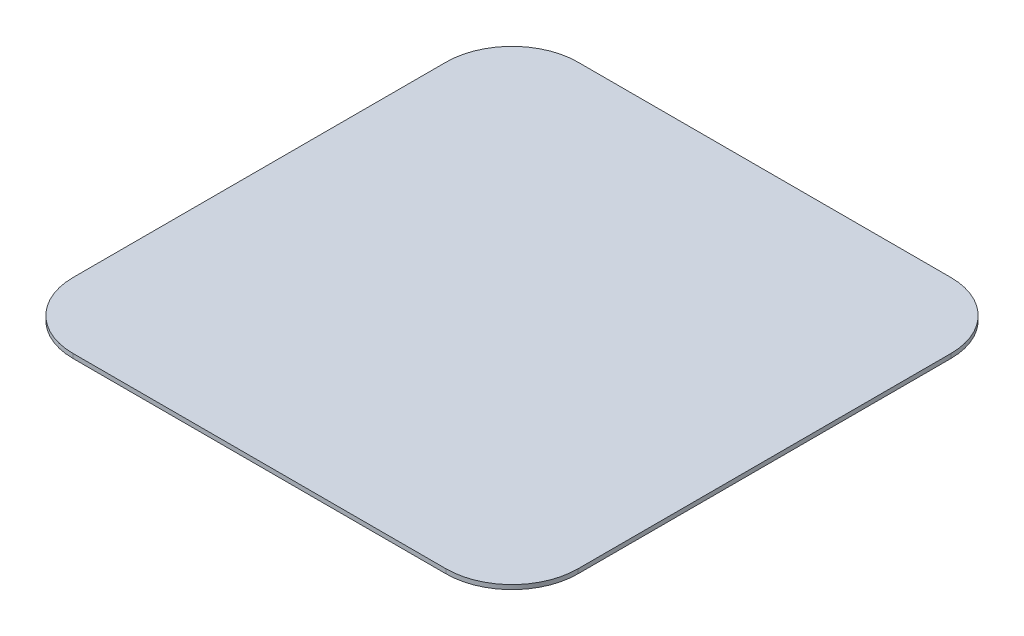
ISO-10303-21;
HEADER;
FILE_DESCRIPTION(('STEP AP214'),'2;1');
FILE_NAME('part.step','',(''),(''),'','','');
FILE_SCHEMA(('AUTOMOTIVE_DESIGN { 1 0 10303 214 1 1 1 1 }'));
ENDSEC;
DATA;
#1=APPLICATION_CONTEXT('core data for automotive mechanical design processes');
#2=APPLICATION_PROTOCOL_DEFINITION('international standard','automotive_design',2000,#1);
#3=PRODUCT_CONTEXT('',#1,'mechanical');
#4=PRODUCT('Part','Part','',(#3));
#5=PRODUCT_RELATED_PRODUCT_CATEGORY('part','',(#4));
#6=PRODUCT_DEFINITION_FORMATION('','',#4);
#7=PRODUCT_DEFINITION_CONTEXT('part definition',#1,'design');
#8=PRODUCT_DEFINITION('design','',#6,#7);
#9=PRODUCT_DEFINITION_SHAPE('','',#8);
#10=(LENGTH_UNIT() NAMED_UNIT(*) SI_UNIT(.MILLI.,.METRE.));
#11=(NAMED_UNIT(*) PLANE_ANGLE_UNIT() SI_UNIT($,.RADIAN.));
#12=(NAMED_UNIT(*) SI_UNIT($,.STERADIAN.) SOLID_ANGLE_UNIT());
#13=UNCERTAINTY_MEASURE_WITH_UNIT(LENGTH_MEASURE(1.E-05),#10,'distance_accuracy_value','');
#14=(GEOMETRIC_REPRESENTATION_CONTEXT(3) GLOBAL_UNCERTAINTY_ASSIGNED_CONTEXT((#13)) GLOBAL_UNIT_ASSIGNED_CONTEXT((#10,
#11,#12)) REPRESENTATION_CONTEXT('',''));
#15=CARTESIAN_POINT('',(0.,0.,0.));
#16=DIRECTION('',(0.,0.,1.));
#17=DIRECTION('',(1.,0.,0.));
#18=AXIS2_PLACEMENT_3D('',#15,#16,#17);
#19=CARTESIAN_POINT('',(115.,2.,-115.));
#20=DIRECTION('',(-1.,0.,0.));
#21=DIRECTION('',(0.,0.,1.));
#22=AXIS2_PLACEMENT_3D('',#19,#20,#21);
#23=PLANE('',#22);
#24=DIRECTION('',(0.,0.,-1.));
#25=VECTOR('',#24,1.);
#26=CARTESIAN_POINT('',(115.,0.,-115.));
#27=LINE('',#26,#25);
#28=CARTESIAN_POINT('',(115.,0.,85.));
#29=VERTEX_POINT('',#28);
#30=CARTESIAN_POINT('',(115.,0.,-85.));
#31=VERTEX_POINT('',#30);
#32=EDGE_CURVE('E141',#29,#31,#27,.T.);
#33=ORIENTED_EDGE('',*,*,#32,.T.);
#34=DIRECTION('',(0.,-1.,0.));
#35=VECTOR('',#34,1.);
#36=CARTESIAN_POINT('',(115.,2.,-85.));
#37=LINE('',#36,#35);
#38=CARTESIAN_POINT('',(115.,2.,-85.));
#39=VERTEX_POINT('',#38);
#40=EDGE_CURVE('E11',#31,#39,#37,.F.);
#41=ORIENTED_EDGE('',*,*,#40,.T.);
#42=DIRECTION('',(0.,0.,-1.));
#43=VECTOR('',#42,1.);
#44=CARTESIAN_POINT('',(115.,2.,-115.));
#45=LINE('',#44,#43);
#46=CARTESIAN_POINT('',(115.,2.,85.));
#47=VERTEX_POINT('',#46);
#48=EDGE_CURVE('E139',#47,#39,#45,.T.);
#49=ORIENTED_EDGE('',*,*,#48,.F.);
#50=DIRECTION('',(0.,-1.,0.));
#51=VECTOR('',#50,1.);
#52=CARTESIAN_POINT('',(115.,2.,85.));
#53=LINE('',#52,#51);
#54=EDGE_CURVE('E48',#47,#29,#53,.T.);
#55=ORIENTED_EDGE('',*,*,#54,.T.);
#56=EDGE_LOOP('',(#33,#41,#49,#55));
#57=FACE_BOUND('',#56,.T.);
#58=ADVANCED_FACE('F39',(#57),#23,.F.);
#59=CARTESIAN_POINT('',(-115.,2.,-115.));
#60=DIRECTION('',(0.,0.,1.));
#61=DIRECTION('',(1.,0.,0.));
#62=AXIS2_PLACEMENT_3D('',#59,#60,#61);
#63=PLANE('',#62);
#64=DIRECTION('',(-1.,0.,0.));
#65=VECTOR('',#64,1.);
#66=CARTESIAN_POINT('',(-115.,0.,-115.));
#67=LINE('',#66,#65);
#68=CARTESIAN_POINT('',(85.,0.,-115.));
#69=VERTEX_POINT('',#68);
#70=CARTESIAN_POINT('',(-85.,0.,-115.));
#71=VERTEX_POINT('',#70);
#72=EDGE_CURVE('E135',#69,#71,#67,.T.);
#73=ORIENTED_EDGE('',*,*,#72,.T.);
#74=DIRECTION('',(0.,-1.,0.));
#75=VECTOR('',#74,1.);
#76=CARTESIAN_POINT('',(-85.,2.,-115.));
#77=LINE('',#76,#75);
#78=CARTESIAN_POINT('',(-85.,2.,-115.));
#79=VERTEX_POINT('',#78);
#80=EDGE_CURVE('E111',#71,#79,#77,.F.);
#81=ORIENTED_EDGE('',*,*,#80,.T.);
#82=DIRECTION('',(-1.,0.,0.));
#83=VECTOR('',#82,1.);
#84=CARTESIAN_POINT('',(-115.,2.,-115.));
#85=LINE('',#84,#83);
#86=CARTESIAN_POINT('',(85.,2.,-115.));
#87=VERTEX_POINT('',#86);
#88=EDGE_CURVE('E193',#87,#79,#85,.T.);
#89=ORIENTED_EDGE('',*,*,#88,.F.);
#90=DIRECTION('',(0.,-1.,0.));
#91=VECTOR('',#90,1.);
#92=CARTESIAN_POINT('',(85.,2.,-115.));
#93=LINE('',#92,#91);
#94=EDGE_CURVE('E117',#87,#69,#93,.T.);
#95=ORIENTED_EDGE('',*,*,#94,.T.);
#96=EDGE_LOOP('',(#73,#81,#89,#95));
#97=FACE_BOUND('',#96,.T.);
#98=ADVANCED_FACE('F205',(#97),#63,.F.);
#99=CARTESIAN_POINT('',(-115.,2.,-115.));
#100=DIRECTION('',(1.,0.,0.));
#101=DIRECTION('',(0.,0.,-1.));
#102=AXIS2_PLACEMENT_3D('',#99,#100,#101);
#103=PLANE('',#102);
#104=DIRECTION('',(0.,0.,1.));
#105=VECTOR('',#104,1.);
#106=CARTESIAN_POINT('',(-115.,2.,-115.));
#107=LINE('',#106,#105);
#108=CARTESIAN_POINT('',(-115.,2.,-85.));
#109=VERTEX_POINT('',#108);
#110=CARTESIAN_POINT('',(-115.,2.,85.));
#111=VERTEX_POINT('',#110);
#112=EDGE_CURVE('E126',#109,#111,#107,.T.);
#113=ORIENTED_EDGE('',*,*,#112,.F.);
#114=DIRECTION('',(0.,-1.,0.));
#115=VECTOR('',#114,1.);
#116=CARTESIAN_POINT('',(-115.,2.,-85.));
#117=LINE('',#116,#115);
#118=CARTESIAN_POINT('',(-115.,0.,-85.));
#119=VERTEX_POINT('',#118);
#120=EDGE_CURVE('E110',#109,#119,#117,.T.);
#121=ORIENTED_EDGE('',*,*,#120,.T.);
#122=DIRECTION('',(0.,0.,1.));
#123=VECTOR('',#122,1.);
#124=CARTESIAN_POINT('',(-115.,0.,-115.));
#125=LINE('',#124,#123);
#126=CARTESIAN_POINT('',(-115.,0.,85.));
#127=VERTEX_POINT('',#126);
#128=EDGE_CURVE('E124',#119,#127,#125,.T.);
#129=ORIENTED_EDGE('',*,*,#128,.T.);
#130=DIRECTION('',(0.,-1.,0.));
#131=VECTOR('',#130,1.);
#132=CARTESIAN_POINT('',(-115.,2.,85.));
#133=LINE('',#132,#131);
#134=EDGE_CURVE('E129',#127,#111,#133,.F.);
#135=ORIENTED_EDGE('',*,*,#134,.T.);
#136=EDGE_LOOP('',(#113,#121,#129,#135));
#137=FACE_BOUND('',#136,.T.);
#138=ADVANCED_FACE('F123',(#137),#103,.F.);
#139=CARTESIAN_POINT('',(-115.,2.,115.));
#140=DIRECTION('',(0.,0.,-1.));
#141=DIRECTION('',(-1.,0.,0.));
#142=AXIS2_PLACEMENT_3D('',#139,#140,#141);
#143=PLANE('',#142);
#144=DIRECTION('',(1.,0.,0.));
#145=VECTOR('',#144,1.);
#146=CARTESIAN_POINT('',(-115.,2.,115.));
#147=LINE('',#146,#145);
#148=CARTESIAN_POINT('',(-85.,2.,115.));
#149=VERTEX_POINT('',#148);
#150=CARTESIAN_POINT('',(85.,2.,115.));
#151=VERTEX_POINT('',#150);
#152=EDGE_CURVE('E146',#149,#151,#147,.T.);
#153=ORIENTED_EDGE('',*,*,#152,.F.);
#154=DIRECTION('',(0.,-1.,0.));
#155=VECTOR('',#154,1.);
#156=CARTESIAN_POINT('',(-85.,2.,115.));
#157=LINE('',#156,#155);
#158=CARTESIAN_POINT('',(-85.,0.,115.));
#159=VERTEX_POINT('',#158);
#160=EDGE_CURVE('E173',#149,#159,#157,.T.);
#161=ORIENTED_EDGE('',*,*,#160,.T.);
#162=DIRECTION('',(1.,0.,0.));
#163=VECTOR('',#162,1.);
#164=CARTESIAN_POINT('',(-115.,0.,115.));
#165=LINE('',#164,#163);
#166=CARTESIAN_POINT('',(85.,0.,115.));
#167=VERTEX_POINT('',#166);
#168=EDGE_CURVE('E134',#159,#167,#165,.T.);
#169=ORIENTED_EDGE('',*,*,#168,.T.);
#170=DIRECTION('',(0.,-1.,0.));
#171=VECTOR('',#170,1.);
#172=CARTESIAN_POINT('',(85.,2.,115.));
#173=LINE('',#172,#171);
#174=EDGE_CURVE('E55',#167,#151,#173,.F.);
#175=ORIENTED_EDGE('',*,*,#174,.T.);
#176=EDGE_LOOP('',(#153,#161,#169,#175));
#177=FACE_BOUND('',#176,.T.);
#178=ADVANCED_FACE('F209',(#177),#143,.F.);
#179=CARTESIAN_POINT('',(0.,2.,0.));
#180=DIRECTION('',(0.,1.,0.));
#181=DIRECTION('',(0.,0.,1.));
#182=AXIS2_PLACEMENT_3D('',#179,#180,#181);
#183=PLANE('',#182);
#184=ORIENTED_EDGE('',*,*,#88,.T.);
#185=CARTESIAN_POINT('',(-85.,2.,-85.));
#186=DIRECTION('',(0.,1.,0.));
#187=DIRECTION('',(0.,0.,1.));
#188=AXIS2_PLACEMENT_3D('',#185,#186,#187);
#189=CIRCLE('',#188,30.);
#190=EDGE_CURVE('E168',#79,#109,#189,.T.);
#191=ORIENTED_EDGE('',*,*,#190,.T.);
#192=ORIENTED_EDGE('',*,*,#112,.T.);
#193=CARTESIAN_POINT('',(-85.,2.,85.));
#194=DIRECTION('',(0.,1.,0.));
#195=DIRECTION('',(0.,0.,1.));
#196=AXIS2_PLACEMENT_3D('',#193,#194,#195);
#197=CIRCLE('',#196,30.);
#198=EDGE_CURVE('E62',#111,#149,#197,.T.);
#199=ORIENTED_EDGE('',*,*,#198,.T.);
#200=ORIENTED_EDGE('',*,*,#152,.T.);
#201=CARTESIAN_POINT('',(85.,2.,85.));
#202=DIRECTION('',(0.,1.,0.));
#203=DIRECTION('',(0.,0.,1.));
#204=AXIS2_PLACEMENT_3D('',#201,#202,#203);
#205=CIRCLE('',#204,30.);
#206=EDGE_CURVE('E160',#151,#47,#205,.T.);
#207=ORIENTED_EDGE('',*,*,#206,.T.);
#208=ORIENTED_EDGE('',*,*,#48,.T.);
#209=CARTESIAN_POINT('',(85.,2.,-85.));
#210=DIRECTION('',(0.,1.,0.));
#211=DIRECTION('',(0.,0.,1.));
#212=AXIS2_PLACEMENT_3D('',#209,#210,#211);
#213=CIRCLE('',#212,30.);
#214=EDGE_CURVE('E163',#39,#87,#213,.T.);
#215=ORIENTED_EDGE('',*,*,#214,.T.);
#216=EDGE_LOOP('',(#184,#191,#192,#199,#200,#207,#208,#215));
#217=FACE_BOUND('',#216,.T.);
#218=ADVANCED_FACE('F199',(#217),#183,.T.);
#219=CARTESIAN_POINT('',(0.,0.,0.));
#220=DIRECTION('',(0.,1.,0.));
#221=DIRECTION('',(0.,0.,1.));
#222=AXIS2_PLACEMENT_3D('',#219,#220,#221);
#223=PLANE('',#222);
#224=ORIENTED_EDGE('',*,*,#128,.F.);
#225=CARTESIAN_POINT('',(-85.,0.,-85.));
#226=DIRECTION('',(0.,1.,0.));
#227=DIRECTION('',(0.,0.,1.));
#228=AXIS2_PLACEMENT_3D('',#225,#226,#227);
#229=CIRCLE('',#228,30.);
#230=EDGE_CURVE('E106',#119,#71,#229,.F.);
#231=ORIENTED_EDGE('',*,*,#230,.T.);
#232=ORIENTED_EDGE('',*,*,#72,.F.);
#233=CARTESIAN_POINT('',(85.,0.,-85.));
#234=DIRECTION('',(0.,1.,0.));
#235=DIRECTION('',(0.,0.,1.));
#236=AXIS2_PLACEMENT_3D('',#233,#234,#235);
#237=CIRCLE('',#236,30.);
#238=EDGE_CURVE('E150',#69,#31,#237,.F.);
#239=ORIENTED_EDGE('',*,*,#238,.T.);
#240=ORIENTED_EDGE('',*,*,#32,.F.);
#241=CARTESIAN_POINT('',(85.,0.,85.));
#242=DIRECTION('',(0.,1.,0.));
#243=DIRECTION('',(0.,0.,1.));
#244=AXIS2_PLACEMENT_3D('',#241,#242,#243);
#245=CIRCLE('',#244,30.);
#246=EDGE_CURVE('E128',#29,#167,#245,.F.);
#247=ORIENTED_EDGE('',*,*,#246,.T.);
#248=ORIENTED_EDGE('',*,*,#168,.F.);
#249=CARTESIAN_POINT('',(-85.,0.,85.));
#250=DIRECTION('',(0.,1.,0.));
#251=DIRECTION('',(0.,0.,1.));
#252=AXIS2_PLACEMENT_3D('',#249,#250,#251);
#253=CIRCLE('',#252,30.);
#254=EDGE_CURVE('E118',#159,#127,#253,.F.);
#255=ORIENTED_EDGE('',*,*,#254,.T.);
#256=EDGE_LOOP('',(#224,#231,#232,#239,#240,#247,#248,#255));
#257=FACE_BOUND('',#256,.T.);
#258=ADVANCED_FACE('F131',(#257),#223,.F.);
#259=CARTESIAN_POINT('',(-85.,2.,-85.));
#260=DIRECTION('',(0.,-1.,0.));
#261=DIRECTION('',(0.,0.,-1.));
#262=AXIS2_PLACEMENT_3D('',#259,#260,#261);
#263=CYLINDRICAL_SURFACE('',#262,30.);
#264=ORIENTED_EDGE('',*,*,#190,.F.);
#265=ORIENTED_EDGE('',*,*,#80,.F.);
#266=ORIENTED_EDGE('',*,*,#230,.F.);
#267=ORIENTED_EDGE('',*,*,#120,.F.);
#268=EDGE_LOOP('',(#264,#265,#266,#267));
#269=FACE_BOUND('',#268,.T.);
#270=ADVANCED_FACE('F109',(#269),#263,.T.);
#271=CARTESIAN_POINT('',(-85.,2.,85.));
#272=DIRECTION('',(0.,-1.,0.));
#273=DIRECTION('',(0.,0.,-1.));
#274=AXIS2_PLACEMENT_3D('',#271,#272,#273);
#275=CYLINDRICAL_SURFACE('',#274,30.);
#276=ORIENTED_EDGE('',*,*,#198,.F.);
#277=ORIENTED_EDGE('',*,*,#134,.F.);
#278=ORIENTED_EDGE('',*,*,#254,.F.);
#279=ORIENTED_EDGE('',*,*,#160,.F.);
#280=EDGE_LOOP('',(#276,#277,#278,#279));
#281=FACE_BOUND('',#280,.T.);
#282=ADVANCED_FACE('F208',(#281),#275,.T.);
#283=CARTESIAN_POINT('',(85.,2.,-85.));
#284=DIRECTION('',(0.,-1.,0.));
#285=DIRECTION('',(0.,0.,-1.));
#286=AXIS2_PLACEMENT_3D('',#283,#284,#285);
#287=CYLINDRICAL_SURFACE('',#286,30.);
#288=ORIENTED_EDGE('',*,*,#214,.F.);
#289=ORIENTED_EDGE('',*,*,#40,.F.);
#290=ORIENTED_EDGE('',*,*,#238,.F.);
#291=ORIENTED_EDGE('',*,*,#94,.F.);
#292=EDGE_LOOP('',(#288,#289,#290,#291));
#293=FACE_BOUND('',#292,.T.);
#294=ADVANCED_FACE('F203',(#293),#287,.T.);
#295=CARTESIAN_POINT('',(85.,2.,85.));
#296=DIRECTION('',(0.,-1.,0.));
#297=DIRECTION('',(0.,0.,-1.));
#298=AXIS2_PLACEMENT_3D('',#295,#296,#297);
#299=CYLINDRICAL_SURFACE('',#298,30.);
#300=ORIENTED_EDGE('',*,*,#206,.F.);
#301=ORIENTED_EDGE('',*,*,#174,.F.);
#302=ORIENTED_EDGE('',*,*,#246,.F.);
#303=ORIENTED_EDGE('',*,*,#54,.F.);
#304=EDGE_LOOP('',(#300,#301,#302,#303));
#305=FACE_BOUND('',#304,.T.);
#306=ADVANCED_FACE('F41',(#305),#299,.T.);
#307=CLOSED_SHELL('',(#58,#98,#138,#178,#218,#258,#270,#282,#294,#306));
#308=MANIFOLD_SOLID_BREP('B2',#307);
#309=ADVANCED_BREP_SHAPE_REPRESENTATION('',(#18,#308),#14);
#310=SHAPE_DEFINITION_REPRESENTATION(#9,#309);
ENDSEC;
END-ISO-10303-21;
